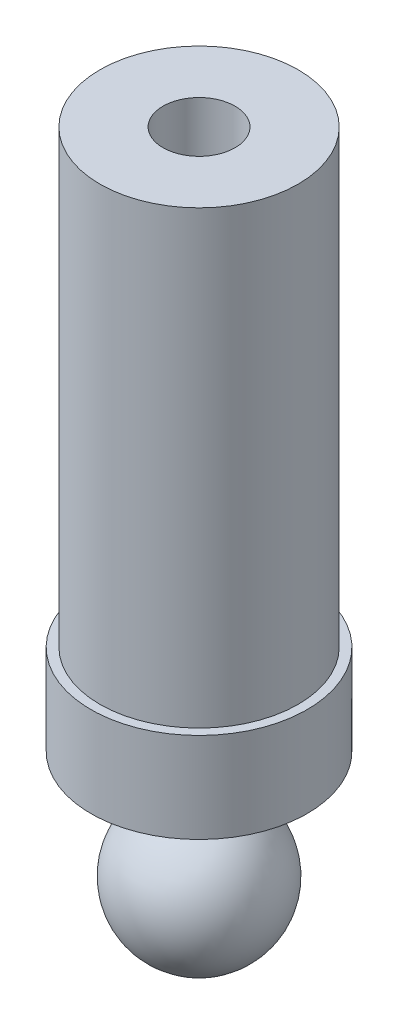
ISO-10303-21;
HEADER;
FILE_DESCRIPTION(('STEP AP214'),'2;1');
FILE_NAME('part.step','',(''),(''),'','','');
FILE_SCHEMA(('AUTOMOTIVE_DESIGN { 1 0 10303 214 1 1 1 1 }'));
ENDSEC;
DATA;
#1=APPLICATION_CONTEXT('core data for automotive mechanical design processes');
#2=APPLICATION_PROTOCOL_DEFINITION('international standard','automotive_design',2000,#1);
#3=PRODUCT_CONTEXT('',#1,'mechanical');
#4=PRODUCT('Part','Part','',(#3));
#5=PRODUCT_RELATED_PRODUCT_CATEGORY('part','',(#4));
#6=PRODUCT_DEFINITION_FORMATION('','',#4);
#7=PRODUCT_DEFINITION_CONTEXT('part definition',#1,'design');
#8=PRODUCT_DEFINITION('design','',#6,#7);
#9=PRODUCT_DEFINITION_SHAPE('','',#8);
#10=(LENGTH_UNIT() NAMED_UNIT(*) SI_UNIT(.MILLI.,.METRE.));
#11=(NAMED_UNIT(*) PLANE_ANGLE_UNIT() SI_UNIT($,.RADIAN.));
#12=(NAMED_UNIT(*) SI_UNIT($,.STERADIAN.) SOLID_ANGLE_UNIT());
#13=UNCERTAINTY_MEASURE_WITH_UNIT(LENGTH_MEASURE(1.E-05),#10,'distance_accuracy_value','');
#14=(GEOMETRIC_REPRESENTATION_CONTEXT(3) GLOBAL_UNCERTAINTY_ASSIGNED_CONTEXT((#13)) GLOBAL_UNIT_ASSIGNED_CONTEXT((#10,
#11,#12)) REPRESENTATION_CONTEXT('',''));
#15=CARTESIAN_POINT('',(0.,0.,0.));
#16=DIRECTION('',(0.,0.,1.));
#17=DIRECTION('',(1.,0.,0.));
#18=AXIS2_PLACEMENT_3D('',#15,#16,#17);
#19=CARTESIAN_POINT('',(0.,-3.,0.));
#20=DIRECTION('',(0.,1.,0.));
#21=DIRECTION('',(0.,0.,1.));
#22=AXIS2_PLACEMENT_3D('',#19,#20,#21);
#23=CYLINDRICAL_SURFACE('',#22,2.);
#24=CARTESIAN_POINT('',(0.,0.,0.));
#25=DIRECTION('',(0.,-1.,0.));
#26=DIRECTION('',(0.,0.,-1.));
#27=AXIS2_PLACEMENT_3D('',#24,#25,#26);
#28=CIRCLE('',#27,2.);
#29=CARTESIAN_POINT('',(0.,0.,-2.));
#30=VERTEX_POINT('',#29);
#31=EDGE_CURVE('E51',#30,#30,#28,.T.);
#32=ORIENTED_EDGE('',*,*,#31,.T.);
#33=EDGE_LOOP('',(#32));
#34=FACE_BOUND('',#33,.T.);
#35=CARTESIAN_POINT('',(0.,-2.53589838486224,0.));
#36=DIRECTION('',(0.,-1.,0.));
#37=DIRECTION('',(0.,0.,-1.));
#38=AXIS2_PLACEMENT_3D('',#35,#36,#37);
#39=CIRCLE('',#38,2.);
#40=CARTESIAN_POINT('',(0.,-2.53589838486224,-2.));
#41=VERTEX_POINT('',#40);
#42=EDGE_CURVE('E11',#41,#41,#39,.T.);
#43=ORIENTED_EDGE('',*,*,#42,.F.);
#44=EDGE_LOOP('',(#43));
#45=FACE_BOUND('',#44,.T.);
#46=ADVANCED_FACE('F45',(#34,#45),#23,.T.);
#47=CARTESIAN_POINT('',(0.,0.,0.));
#48=DIRECTION('',(0.,-1.,0.));
#49=DIRECTION('',(0.,0.,-1.));
#50=AXIS2_PLACEMENT_3D('',#47,#48,#49);
#51=PLANE('',#50);
#52=ORIENTED_EDGE('',*,*,#31,.F.);
#53=EDGE_LOOP('',(#52));
#54=FACE_BOUND('',#53,.T.);
#55=ADVANCED_FACE('F59',(#54),#51,.F.);
#56=CARTESIAN_POINT('',(0.,-6.,0.));
#57=DIRECTION('',(-1.,0.,0.));
#58=DIRECTION('',(0.,0.,-1.));
#59=AXIS2_PLACEMENT_3D('',#56,#57,#58);
#60=SPHERICAL_SURFACE('',#59,4.);
#61=CARTESIAN_POINT('',(0.,-6.,0.));
#62=DIRECTION('',(0.,-1.,0.));
#63=DIRECTION('',(0.,0.,-1.));
#64=AXIS2_PLACEMENT_3D('',#61,#62,#63);
#65=SPHERICAL_SURFACE('',#64,4.);
#66=ORIENTED_EDGE('',*,*,#42,.T.);
#67=EDGE_LOOP('',(#66));
#68=FACE_BOUND('',#67,.T.);
#69=ADVANCED_FACE('F61',(#68),#65,.T.);
#70=CLOSED_SHELL('',(#46,#55,#69));
#71=MANIFOLD_SOLID_BREP('B2',#70);
#72=CARTESIAN_POINT('',(0.,45.,0.));
#73=DIRECTION('',(0.,-1.,0.));
#74=DIRECTION('',(0.,0.,-1.));
#75=AXIS2_PLACEMENT_3D('',#72,#73,#74);
#76=CYLINDRICAL_SURFACE('',#75,6.);
#77=CARTESIAN_POINT('',(0.,0.,0.));
#78=DIRECTION('',(0.,1.,0.));
#79=DIRECTION('',(0.,0.,1.));
#80=AXIS2_PLACEMENT_3D('',#77,#78,#79);
#81=CIRCLE('',#80,6.);
#82=CARTESIAN_POINT('',(0.,0.,-6.));
#83=VERTEX_POINT('',#82);
#84=EDGE_CURVE('E44',#83,#83,#81,.T.);
#85=CARTESIAN_POINT('',(0.,5.,0.));
#86=DIRECTION('',(0.,1.,0.));
#87=DIRECTION('',(0.,0.,1.));
#88=AXIS2_PLACEMENT_3D('',#85,#86,#87);
#89=CIRCLE('',#88,6.);
#90=CARTESIAN_POINT('',(0.,5.,-6.));
#91=VERTEX_POINT('',#90);
#92=EDGE_CURVE('E100',#91,#91,#89,.T.);
#93=CARTESIAN_POINT('',(0.,0.,-6.));
#94=CARTESIAN_POINT('',(0.,0.0520833333333253,-6.));
#95=CARTESIAN_POINT('',(0.,0.104166666666657,-6.));
#96=CARTESIAN_POINT('',(0.,0.208333333333324,-6.));
#97=CARTESIAN_POINT('',(0.,0.260416666666659,-6.));
#98=CARTESIAN_POINT('',(0.,0.364583333333328,-6.));
#99=CARTESIAN_POINT('',(0.,0.416666666666662,-6.));
#100=CARTESIAN_POINT('',(0.,0.520833333333329,-6.));
#101=CARTESIAN_POINT('',(0.,0.572916666666661,-6.));
#102=CARTESIAN_POINT('',(0.,0.677083333333326,-6.));
#103=CARTESIAN_POINT('',(0.,0.729166666666658,-6.));
#104=CARTESIAN_POINT('',(0.,0.833333333333325,-6.));
#105=CARTESIAN_POINT('',(0.,0.885416666666659,-6.));
#106=CARTESIAN_POINT('',(0.,0.989583333333328,-6.));
#107=CARTESIAN_POINT('',(0.,1.04166666666666,-6.));
#108=CARTESIAN_POINT('',(0.,1.14583333333333,-6.));
#109=CARTESIAN_POINT('',(0.,1.19791666666666,-6.));
#110=CARTESIAN_POINT('',(0.,1.30208333333333,-6.));
#111=CARTESIAN_POINT('',(0.,1.35416666666666,-6.));
#112=CARTESIAN_POINT('',(0.,1.45833333333333,-6.));
#113=CARTESIAN_POINT('',(0.,1.51041666666666,-6.));
#114=CARTESIAN_POINT('',(0.,1.61458333333333,-6.));
#115=CARTESIAN_POINT('',(0.,1.66666666666666,-6.));
#116=CARTESIAN_POINT('',(0.,1.77083333333333,-6.));
#117=CARTESIAN_POINT('',(0.,1.82291666666666,-6.));
#118=CARTESIAN_POINT('',(0.,1.92708333333333,-6.));
#119=CARTESIAN_POINT('',(0.,1.97916666666666,-6.));
#120=CARTESIAN_POINT('',(0.,2.08333333333333,-6.));
#121=CARTESIAN_POINT('',(0.,2.13541666666666,-6.));
#122=CARTESIAN_POINT('',(0.,2.23958333333333,-6.));
#123=CARTESIAN_POINT('',(0.,2.29166666666666,-6.));
#124=CARTESIAN_POINT('',(0.,2.39583333333333,-6.));
#125=CARTESIAN_POINT('',(0.,2.44791666666666,-6.));
#126=CARTESIAN_POINT('',(0.,2.55208333333333,-6.));
#127=CARTESIAN_POINT('',(0.,2.60416666666666,-6.));
#128=CARTESIAN_POINT('',(0.,2.70833333333333,-6.));
#129=CARTESIAN_POINT('',(0.,2.76041666666666,-6.));
#130=CARTESIAN_POINT('',(0.,2.86458333333333,-6.));
#131=CARTESIAN_POINT('',(0.,2.91666666666666,-6.));
#132=CARTESIAN_POINT('',(0.,3.02083333333333,-6.));
#133=CARTESIAN_POINT('',(0.,3.07291666666666,-6.));
#134=CARTESIAN_POINT('',(0.,3.17708333333333,-6.));
#135=CARTESIAN_POINT('',(0.,3.22916666666666,-6.));
#136=CARTESIAN_POINT('',(0.,3.33333333333333,-6.));
#137=CARTESIAN_POINT('',(0.,3.38541666666666,-6.));
#138=CARTESIAN_POINT('',(0.,3.48958333333333,-6.));
#139=CARTESIAN_POINT('',(0.,3.54166666666667,-6.));
#140=CARTESIAN_POINT('',(0.,3.64583333333333,-6.));
#141=CARTESIAN_POINT('',(0.,3.69791666666666,-6.));
#142=CARTESIAN_POINT('',(0.,3.80208333333333,-6.));
#143=CARTESIAN_POINT('',(0.,3.85416666666666,-6.));
#144=CARTESIAN_POINT('',(0.,3.95833333333333,-6.));
#145=CARTESIAN_POINT('',(0.,4.01041666666666,-6.));
#146=CARTESIAN_POINT('',(0.,4.11458333333333,-6.));
#147=CARTESIAN_POINT('',(0.,4.16666666666667,-6.));
#148=CARTESIAN_POINT('',(0.,4.27083333333333,-6.));
#149=CARTESIAN_POINT('',(0.,4.32291666666667,-6.));
#150=CARTESIAN_POINT('',(0.,4.42708333333333,-6.));
#151=CARTESIAN_POINT('',(0.,4.47916666666666,-6.));
#152=CARTESIAN_POINT('',(0.,4.58333333333333,-6.));
#153=CARTESIAN_POINT('',(0.,4.63541666666666,-6.));
#154=CARTESIAN_POINT('',(0.,4.73958333333333,-6.));
#155=CARTESIAN_POINT('',(0.,4.79166666666667,-6.));
#156=CARTESIAN_POINT('',(0.,4.89583333333333,-6.));
#157=CARTESIAN_POINT('',(0.,4.94791666666667,-6.));
#158=CARTESIAN_POINT('',(0.,5.,-6.));
#159=B_SPLINE_CURVE_WITH_KNOTS('',3,(#93,#94,#95,#96,#97,#98,#99,#100,#101,#102,#103,#104,#105,
#106,#107,#108,#109,#110,#111,#112,#113,#114,#115,#116,#117,#118,#119,#120,#121,#122,#123,#124,
#125,#126,#127,#128,#129,#130,#131,#132,#133,#134,#135,#136,#137,#138,#139,#140,#141,#142,#143,
#144,#145,#146,#147,#148,#149,#150,#151,#152,#153,#154,#155,#156,#157,#158),.UNSPECIFIED.,.F.,
.F.,(4,2,2,2,2,2,2,2,2,2,2,2,2,2,2,2,2,2,2,2,2,2,2,2,2,2,2,2,2,2,2,2,4),(0.,0.156249999999997,
0.3125,0.468750000000004,0.625000000000001,0.781249999999997,0.937500000000001,1.09375,1.25,
1.40625,1.5625,1.71875,1.875,2.03125,2.1875,2.34375000000001,2.5,2.65625,2.8125,
2.96875000000001,3.125,3.28125,3.4375,3.59375000000001,3.75,3.90625,4.0625,4.21875000000001,
4.375,4.53125,4.6875,4.84375000000001,5.),.UNSPECIFIED.);
#160=EDGE_CURVE('BSEAM86',#83,#91,#159,.T.);
#161=ORIENTED_EDGE('',*,*,#84,.T.);
#162=ORIENTED_EDGE('',*,*,#92,.F.);
#163=ORIENTED_EDGE('',*,*,#160,.T.);
#164=ORIENTED_EDGE('',*,*,#160,.F.);
#165=EDGE_LOOP('',(#161,#163,#162,#164));
#166=FACE_BOUND('',#165,.T.);
#167=ADVANCED_FACE('F86',(#166),#76,.T.);
#168=CARTESIAN_POINT('',(0.,0.,0.));
#169=DIRECTION('',(0.,1.,0.));
#170=DIRECTION('',(0.,0.,1.));
#171=AXIS2_PLACEMENT_3D('',#168,#169,#170);
#172=PLANE('',#171);
#173=CARTESIAN_POINT('',(0.,0.,0.));
#174=DIRECTION('',(0.,1.,0.));
#175=DIRECTION('',(0.,0.,1.));
#176=AXIS2_PLACEMENT_3D('',#173,#174,#175);
#177=CIRCLE('',#176,2.);
#178=CARTESIAN_POINT('',(0.,0.,2.));
#179=VERTEX_POINT('',#178);
#180=EDGE_CURVE('E109',#179,#179,#177,.T.);
#181=ORIENTED_EDGE('',*,*,#180,.T.);
#182=EDGE_LOOP('',(#181));
#183=FACE_BOUND('',#182,.T.);
#184=ORIENTED_EDGE('',*,*,#84,.F.);
#185=EDGE_LOOP('',(#184));
#186=FACE_BOUND('',#185,.T.);
#187=ADVANCED_FACE('F135',(#183,#186),#172,.F.);
#188=CARTESIAN_POINT('',(0.,5.,0.));
#189=DIRECTION('',(0.,1.,0.));
#190=DIRECTION('',(0.,0.,1.));
#191=AXIS2_PLACEMENT_3D('',#188,#189,#190);
#192=PLANE('',#191);
#193=ORIENTED_EDGE('',*,*,#92,.T.);
#194=EDGE_LOOP('',(#193));
#195=FACE_BOUND('',#194,.T.);
#196=CARTESIAN_POINT('',(0.,5.,0.));
#197=DIRECTION('',(0.,1.,0.));
#198=DIRECTION('',(0.,0.,1.));
#199=AXIS2_PLACEMENT_3D('',#196,#197,#198);
#200=CIRCLE('',#199,5.5);
#201=CARTESIAN_POINT('',(0.,5.,5.5));
#202=VERTEX_POINT('',#201);
#203=EDGE_CURVE('E105',#202,#202,#200,.T.);
#204=ORIENTED_EDGE('',*,*,#203,.F.);
#205=EDGE_LOOP('',(#204));
#206=FACE_BOUND('',#205,.T.);
#207=ADVANCED_FACE('F130',(#195,#206),#192,.T.);
#208=CARTESIAN_POINT('',(0.,43.,0.));
#209=DIRECTION('',(0.,-1.,0.));
#210=DIRECTION('',(0.,0.,-1.));
#211=AXIS2_PLACEMENT_3D('',#208,#209,#210);
#212=CYLINDRICAL_SURFACE('',#211,5.5);
#213=CARTESIAN_POINT('',(0.,30.,0.));
#214=DIRECTION('',(0.,1.,0.));
#215=DIRECTION('',(0.,0.,1.));
#216=AXIS2_PLACEMENT_3D('',#213,#214,#215);
#217=CIRCLE('',#216,5.5);
#218=CARTESIAN_POINT('',(0.,30.,5.5));
#219=VERTEX_POINT('',#218);
#220=EDGE_CURVE('E94',#219,#219,#217,.F.);
#221=ORIENTED_EDGE('',*,*,#220,.T.);
#222=EDGE_LOOP('',(#221));
#223=FACE_BOUND('',#222,.T.);
#224=ORIENTED_EDGE('',*,*,#203,.T.);
#225=EDGE_LOOP('',(#224));
#226=FACE_BOUND('',#225,.T.);
#227=ADVANCED_FACE('F124',(#223,#226),#212,.T.);
#228=CARTESIAN_POINT('',(0.,30.,0.));
#229=DIRECTION('',(0.,1.,0.));
#230=DIRECTION('',(0.,0.,1.));
#231=AXIS2_PLACEMENT_3D('',#228,#229,#230);
#232=PLANE('',#231);
#233=CARTESIAN_POINT('',(0.,30.,0.));
#234=DIRECTION('',(0.,1.,0.));
#235=DIRECTION('',(0.,0.,1.));
#236=AXIS2_PLACEMENT_3D('',#233,#234,#235);
#237=CIRCLE('',#236,2.);
#238=CARTESIAN_POINT('',(0.,30.,2.));
#239=VERTEX_POINT('',#238);
#240=EDGE_CURVE('E89',#239,#239,#237,.T.);
#241=ORIENTED_EDGE('',*,*,#240,.F.);
#242=EDGE_LOOP('',(#241));
#243=FACE_BOUND('',#242,.T.);
#244=ORIENTED_EDGE('',*,*,#220,.F.);
#245=EDGE_LOOP('',(#244));
#246=FACE_BOUND('',#245,.T.);
#247=ADVANCED_FACE('F121',(#243,#246),#232,.T.);
#248=CARTESIAN_POINT('',(0.,-11.,0.));
#249=DIRECTION('',(0.,1.,0.));
#250=DIRECTION('',(0.,0.,1.));
#251=AXIS2_PLACEMENT_3D('',#248,#249,#250);
#252=CYLINDRICAL_SURFACE('',#251,2.);
#253=ORIENTED_EDGE('',*,*,#240,.T.);
#254=EDGE_LOOP('',(#253));
#255=FACE_BOUND('',#254,.T.);
#256=ORIENTED_EDGE('',*,*,#180,.F.);
#257=EDGE_LOOP('',(#256));
#258=FACE_BOUND('',#257,.T.);
#259=ADVANCED_FACE('F118',(#255,#258),#252,.F.);
#260=CLOSED_SHELL('',(#167,#187,#207,#227,#247,#259));
#261=MANIFOLD_SOLID_BREP('B6',#260);
#262=ADVANCED_BREP_SHAPE_REPRESENTATION('',(#18,#71,#261),#14);
#263=SHAPE_DEFINITION_REPRESENTATION(#9,#262);
ENDSEC;
END-ISO-10303-21;
